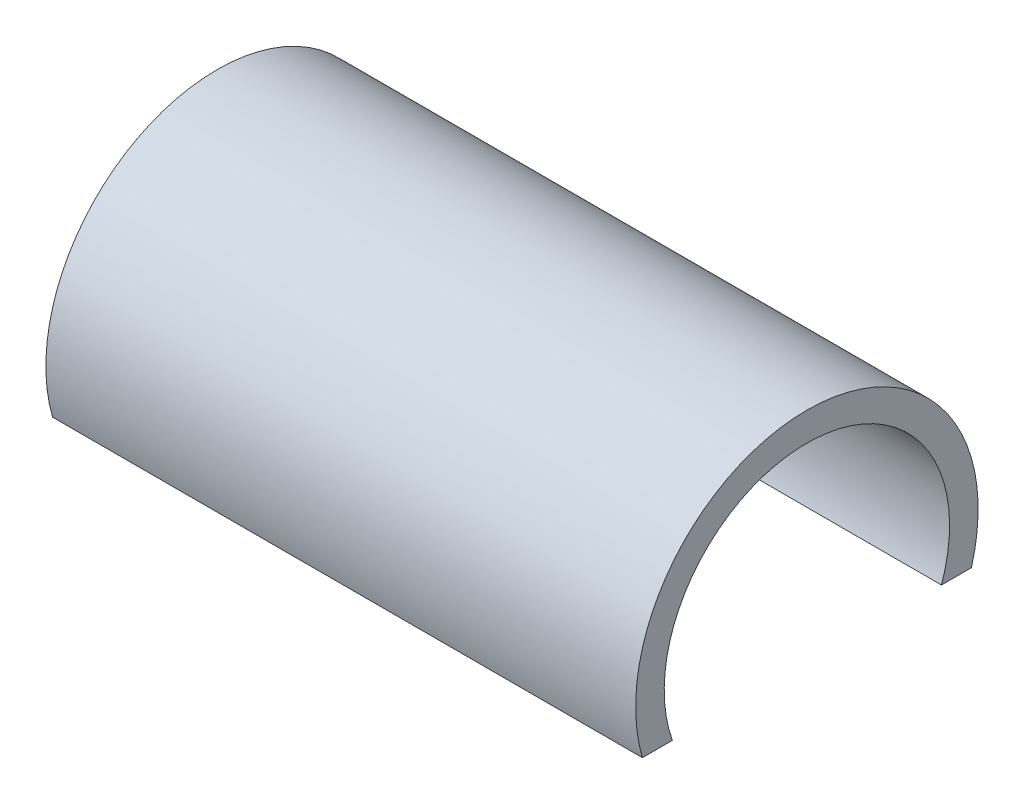
ISO-10303-21;
HEADER;
FILE_DESCRIPTION(('STEP AP214'),'2;1');
FILE_NAME('part.step','',(''),(''),'','','');
FILE_SCHEMA(('AUTOMOTIVE_DESIGN { 1 0 10303 214 1 1 1 1 }'));
ENDSEC;
DATA;
#1=APPLICATION_CONTEXT('core data for automotive mechanical design processes');
#2=APPLICATION_PROTOCOL_DEFINITION('international standard','automotive_design',2000,#1);
#3=PRODUCT_CONTEXT('',#1,'mechanical');
#4=PRODUCT('Part','Part','',(#3));
#5=PRODUCT_RELATED_PRODUCT_CATEGORY('part','',(#4));
#6=PRODUCT_DEFINITION_FORMATION('','',#4);
#7=PRODUCT_DEFINITION_CONTEXT('part definition',#1,'design');
#8=PRODUCT_DEFINITION('design','',#6,#7);
#9=PRODUCT_DEFINITION_SHAPE('','',#8);
#10=(LENGTH_UNIT() NAMED_UNIT(*) SI_UNIT(.MILLI.,.METRE.));
#11=(NAMED_UNIT(*) PLANE_ANGLE_UNIT() SI_UNIT($,.RADIAN.));
#12=(NAMED_UNIT(*) SI_UNIT($,.STERADIAN.) SOLID_ANGLE_UNIT());
#13=UNCERTAINTY_MEASURE_WITH_UNIT(LENGTH_MEASURE(1.E-05),#10,'distance_accuracy_value','');
#14=(GEOMETRIC_REPRESENTATION_CONTEXT(3) GLOBAL_UNCERTAINTY_ASSIGNED_CONTEXT((#13)) GLOBAL_UNIT_ASSIGNED_CONTEXT((#10,
#11,#12)) REPRESENTATION_CONTEXT('',''));
#15=CARTESIAN_POINT('',(0.,0.,0.));
#16=DIRECTION('',(0.,0.,1.));
#17=DIRECTION('',(1.,0.,0.));
#18=AXIS2_PLACEMENT_3D('',#15,#16,#17);
#19=CARTESIAN_POINT('',(-27.,0.,0.));
#20=DIRECTION('',(1.,0.,0.));
#21=DIRECTION('',(0.,0.,-1.));
#22=AXIS2_PLACEMENT_3D('',#19,#20,#21);
#23=CYLINDRICAL_SURFACE('',#22,18.);
#24=DIRECTION('',(1.,0.,0.));
#25=VECTOR('',#24,1.);
#26=CARTESIAN_POINT('',(-27.,-4.99413983591518,17.2933099000546));
#27=LINE('',#26,#25);
#28=CARTESIAN_POINT('',(-27.,-4.99413983591518,17.2933099000546));
#29=VERTEX_POINT('',#28);
#30=CARTESIAN_POINT('',(35.,-4.99413983591518,17.2933099000546));
#31=VERTEX_POINT('',#30);
#32=EDGE_CURVE('E85',#29,#31,#27,.T.);
#33=ORIENTED_EDGE('',*,*,#32,.T.);
#34=CARTESIAN_POINT('',(35.,0.,0.));
#35=DIRECTION('',(1.,0.,0.));
#36=DIRECTION('',(0.,0.,-1.));
#37=AXIS2_PLACEMENT_3D('',#34,#35,#36);
#38=CIRCLE('',#37,18.);
#39=CARTESIAN_POINT('',(35.,-4.99413983591518,-17.2933099000546));
#40=VERTEX_POINT('',#39);
#41=EDGE_CURVE('E84',#40,#31,#38,.T.);
#42=ORIENTED_EDGE('',*,*,#41,.F.);
#43=DIRECTION('',(1.,0.,0.));
#44=VECTOR('',#43,1.);
#45=CARTESIAN_POINT('',(-27.,-4.99413983591518,-17.2933099000546));
#46=LINE('',#45,#44);
#47=CARTESIAN_POINT('',(-27.,-4.99413983591518,-17.2933099000546));
#48=VERTEX_POINT('',#47);
#49=EDGE_CURVE('E72',#48,#40,#46,.T.);
#50=ORIENTED_EDGE('',*,*,#49,.F.);
#51=CARTESIAN_POINT('',(-27.,0.,0.));
#52=DIRECTION('',(1.,0.,0.));
#53=DIRECTION('',(0.,0.,-1.));
#54=AXIS2_PLACEMENT_3D('',#51,#52,#53);
#55=CIRCLE('',#54,18.);
#56=EDGE_CURVE('E82',#48,#29,#55,.T.);
#57=ORIENTED_EDGE('',*,*,#56,.T.);
#58=EDGE_LOOP('',(#33,#42,#50,#57));
#59=FACE_BOUND('',#58,.T.);
#60=ADVANCED_FACE('F32',(#59),#23,.T.);
#61=CARTESIAN_POINT('',(-27.,0.,0.));
#62=DIRECTION('',(1.,0.,0.));
#63=DIRECTION('',(0.,0.,-1.));
#64=AXIS2_PLACEMENT_3D('',#61,#62,#63);
#65=PLANE('',#64);
#66=ORIENTED_EDGE('',*,*,#56,.F.);
#67=DIRECTION('',(0.,0.,1.));
#68=VECTOR('',#67,1.);
#69=CARTESIAN_POINT('',(-27.,-4.99413983591518,17.2933099000546));
#70=LINE('',#69,#68);
#71=CARTESIAN_POINT('',(-27.,-4.99413983591518,-14.1442061388869));
#72=VERTEX_POINT('',#71);
#73=EDGE_CURVE('E69',#48,#72,#70,.T.);
#74=ORIENTED_EDGE('',*,*,#73,.T.);
#75=CARTESIAN_POINT('',(-27.,0.,0.));
#76=DIRECTION('',(1.,0.,0.));
#77=DIRECTION('',(0.,0.,-1.));
#78=AXIS2_PLACEMENT_3D('',#75,#76,#77);
#79=CIRCLE('',#78,15.);
#80=CARTESIAN_POINT('',(-27.,-4.99413983591518,14.1442061388869));
#81=VERTEX_POINT('',#80);
#82=EDGE_CURVE('E89',#72,#81,#79,.T.);
#83=ORIENTED_EDGE('',*,*,#82,.T.);
#84=EDGE_CURVE('E54',#81,#29,#70,.T.);
#85=ORIENTED_EDGE('',*,*,#84,.T.);
#86=EDGE_LOOP('',(#66,#74,#83,#85));
#87=FACE_BOUND('',#86,.T.);
#88=ADVANCED_FACE('F87',(#87),#65,.F.);
#89=CARTESIAN_POINT('',(35.,0.,0.));
#90=DIRECTION('',(1.,0.,0.));
#91=DIRECTION('',(0.,0.,-1.));
#92=AXIS2_PLACEMENT_3D('',#89,#90,#91);
#93=PLANE('',#92);
#94=DIRECTION('',(0.,0.,1.));
#95=VECTOR('',#94,1.);
#96=CARTESIAN_POINT('',(35.,-4.99413983591518,17.2933099000546));
#97=LINE('',#96,#95);
#98=CARTESIAN_POINT('',(35.,-4.99413983591518,-14.1442061388869));
#99=VERTEX_POINT('',#98);
#100=EDGE_CURVE('E46',#40,#99,#97,.T.);
#101=ORIENTED_EDGE('',*,*,#100,.F.);
#102=ORIENTED_EDGE('',*,*,#41,.T.);
#103=CARTESIAN_POINT('',(35.,-4.99413983591518,14.1442061388869));
#104=VERTEX_POINT('',#103);
#105=EDGE_CURVE('E97',#104,#31,#97,.T.);
#106=ORIENTED_EDGE('',*,*,#105,.F.);
#107=CARTESIAN_POINT('',(35.,0.,0.));
#108=DIRECTION('',(1.,0.,0.));
#109=DIRECTION('',(0.,0.,-1.));
#110=AXIS2_PLACEMENT_3D('',#107,#108,#109);
#111=CIRCLE('',#110,15.);
#112=EDGE_CURVE('E92',#99,#104,#111,.T.);
#113=ORIENTED_EDGE('',*,*,#112,.F.);
#114=EDGE_LOOP('',(#101,#102,#106,#113));
#115=FACE_BOUND('',#114,.T.);
#116=ADVANCED_FACE('F102',(#115),#93,.T.);
#117=CARTESIAN_POINT('',(-27.,0.,0.));
#118=DIRECTION('',(1.,0.,0.));
#119=DIRECTION('',(0.,0.,-1.));
#120=AXIS2_PLACEMENT_3D('',#117,#118,#119);
#121=CYLINDRICAL_SURFACE('',#120,15.);
#122=ORIENTED_EDGE('',*,*,#112,.T.);
#123=DIRECTION('',(1.,0.,0.));
#124=VECTOR('',#123,1.);
#125=CARTESIAN_POINT('',(-27.,-4.99413983591518,14.1442061388869));
#126=LINE('',#125,#124);
#127=EDGE_CURVE('E11',#104,#81,#126,.F.);
#128=ORIENTED_EDGE('',*,*,#127,.T.);
#129=ORIENTED_EDGE('',*,*,#82,.F.);
#130=DIRECTION('',(1.,0.,0.));
#131=VECTOR('',#130,1.);
#132=CARTESIAN_POINT('',(-27.,-4.99413983591518,-14.1442061388869));
#133=LINE('',#132,#131);
#134=EDGE_CURVE('E39',#72,#99,#133,.T.);
#135=ORIENTED_EDGE('',*,*,#134,.T.);
#136=EDGE_LOOP('',(#122,#128,#129,#135));
#137=FACE_BOUND('',#136,.T.);
#138=ADVANCED_FACE('F104',(#137),#121,.F.);
#139=CARTESIAN_POINT('',(-27.,-4.99413983591518,17.2933099000546));
#140=DIRECTION('',(0.,1.,0.));
#141=DIRECTION('',(0.,0.,1.));
#142=AXIS2_PLACEMENT_3D('',#139,#140,#141);
#143=PLANE('',#142);
#144=ORIENTED_EDGE('',*,*,#73,.F.);
#145=ORIENTED_EDGE('',*,*,#49,.T.);
#146=ORIENTED_EDGE('',*,*,#100,.T.);
#147=ORIENTED_EDGE('',*,*,#134,.F.);
#148=EDGE_LOOP('',(#144,#145,#146,#147));
#149=FACE_BOUND('',#148,.T.);
#150=ADVANCED_FACE('F71',(#149),#143,.F.);
#151=ORIENTED_EDGE('',*,*,#105,.T.);
#152=ORIENTED_EDGE('',*,*,#32,.F.);
#153=ORIENTED_EDGE('',*,*,#84,.F.);
#154=ORIENTED_EDGE('',*,*,#127,.F.);
#155=EDGE_LOOP('',(#151,#152,#153,#154));
#156=FACE_BOUND('',#155,.T.);
#157=ADVANCED_FACE('F99',(#156),#143,.F.);
#158=CLOSED_SHELL('',(#60,#88,#116,#138,#150,#157));
#159=MANIFOLD_SOLID_BREP('B2',#158);
#160=ADVANCED_BREP_SHAPE_REPRESENTATION('',(#18,#159),#14);
#161=SHAPE_DEFINITION_REPRESENTATION(#9,#160);
ENDSEC;
END-ISO-10303-21;
